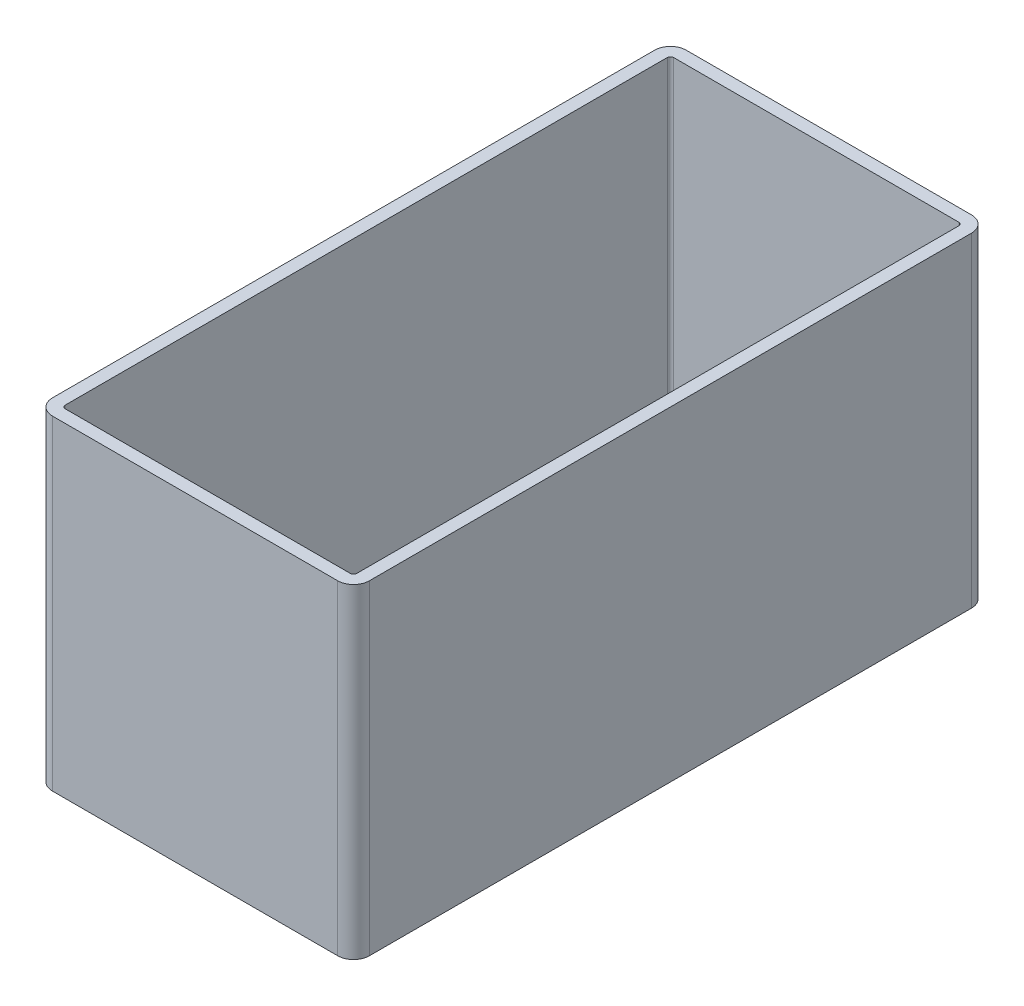
ISO-10303-21;
HEADER;
FILE_DESCRIPTION(('STEP AP214'),'2;1');
FILE_NAME('part.step','',(''),(''),'','','');
FILE_SCHEMA(('AUTOMOTIVE_DESIGN { 1 0 10303 214 1 1 1 1 }'));
ENDSEC;
DATA;
#1=APPLICATION_CONTEXT('core data for automotive mechanical design processes');
#2=APPLICATION_PROTOCOL_DEFINITION('international standard','automotive_design',2000,#1);
#3=PRODUCT_CONTEXT('',#1,'mechanical');
#4=PRODUCT('Part','Part','',(#3));
#5=PRODUCT_RELATED_PRODUCT_CATEGORY('part','',(#4));
#6=PRODUCT_DEFINITION_FORMATION('','',#4);
#7=PRODUCT_DEFINITION_CONTEXT('part definition',#1,'design');
#8=PRODUCT_DEFINITION('design','',#6,#7);
#9=PRODUCT_DEFINITION_SHAPE('','',#8);
#10=(LENGTH_UNIT() NAMED_UNIT(*) SI_UNIT(.MILLI.,.METRE.));
#11=(NAMED_UNIT(*) PLANE_ANGLE_UNIT() SI_UNIT($,.RADIAN.));
#12=(NAMED_UNIT(*) SI_UNIT($,.STERADIAN.) SOLID_ANGLE_UNIT());
#13=UNCERTAINTY_MEASURE_WITH_UNIT(LENGTH_MEASURE(1.E-05),#10,'distance_accuracy_value','');
#14=(GEOMETRIC_REPRESENTATION_CONTEXT(3) GLOBAL_UNCERTAINTY_ASSIGNED_CONTEXT((#13)) GLOBAL_UNIT_ASSIGNED_CONTEXT((#10,
#11,#12)) REPRESENTATION_CONTEXT('',''));
#15=CARTESIAN_POINT('',(0.,0.,0.));
#16=DIRECTION('',(0.,0.,1.));
#17=DIRECTION('',(1.,0.,0.));
#18=AXIS2_PLACEMENT_3D('',#15,#16,#17);
#19=CARTESIAN_POINT('',(10.,10.25,-20.));
#20=DIRECTION('',(-1.,0.,0.));
#21=DIRECTION('',(0.,0.,1.));
#22=AXIS2_PLACEMENT_3D('',#19,#20,#21);
#23=PLANE('',#22);
#24=DIRECTION('',(0.,0.,-1.));
#25=VECTOR('',#24,1.);
#26=CARTESIAN_POINT('',(10.,-10.25,-20.));
#27=LINE('',#26,#25);
#28=CARTESIAN_POINT('',(10.,-10.25,19.));
#29=VERTEX_POINT('',#28);
#30=CARTESIAN_POINT('',(10.,-10.25,-19.));
#31=VERTEX_POINT('',#30);
#32=EDGE_CURVE('E215',#29,#31,#27,.T.);
#33=ORIENTED_EDGE('',*,*,#32,.T.);
#34=DIRECTION('',(0.,-1.,0.));
#35=VECTOR('',#34,1.);
#36=CARTESIAN_POINT('',(10.,10.25,-19.));
#37=LINE('',#36,#35);
#38=CARTESIAN_POINT('',(10.,10.25,-19.));
#39=VERTEX_POINT('',#38);
#40=EDGE_CURVE('E279',#31,#39,#37,.F.);
#41=ORIENTED_EDGE('',*,*,#40,.T.);
#42=DIRECTION('',(0.,0.,-1.));
#43=VECTOR('',#42,1.);
#44=CARTESIAN_POINT('',(10.,10.25,-20.));
#45=LINE('',#44,#43);
#46=CARTESIAN_POINT('',(10.,10.25,19.));
#47=VERTEX_POINT('',#46);
#48=EDGE_CURVE('E227',#47,#39,#45,.T.);
#49=ORIENTED_EDGE('',*,*,#48,.F.);
#50=DIRECTION('',(0.,-1.,0.));
#51=VECTOR('',#50,1.);
#52=CARTESIAN_POINT('',(10.,10.25,19.));
#53=LINE('',#52,#51);
#54=EDGE_CURVE('E276',#47,#29,#53,.T.);
#55=ORIENTED_EDGE('',*,*,#54,.T.);
#56=EDGE_LOOP('',(#33,#41,#49,#55));
#57=FACE_BOUND('',#56,.T.);
#58=ADVANCED_FACE('F46',(#57),#23,.F.);
#59=CARTESIAN_POINT('',(-10.,10.25,-20.));
#60=DIRECTION('',(0.,0.,1.));
#61=DIRECTION('',(1.,0.,0.));
#62=AXIS2_PLACEMENT_3D('',#59,#60,#61);
#63=PLANE('',#62);
#64=DIRECTION('',(-1.,0.,0.));
#65=VECTOR('',#64,1.);
#66=CARTESIAN_POINT('',(-10.,-10.25,-20.));
#67=LINE('',#66,#65);
#68=CARTESIAN_POINT('',(9.,-10.25,-20.));
#69=VERTEX_POINT('',#68);
#70=CARTESIAN_POINT('',(-9.,-10.25,-20.));
#71=VERTEX_POINT('',#70);
#72=EDGE_CURVE('E243',#69,#71,#67,.T.);
#73=ORIENTED_EDGE('',*,*,#72,.T.);
#74=DIRECTION('',(0.,-1.,0.));
#75=VECTOR('',#74,1.);
#76=CARTESIAN_POINT('',(-9.,10.25,-20.));
#77=LINE('',#76,#75);
#78=CARTESIAN_POINT('',(-9.,10.25,-20.));
#79=VERTEX_POINT('',#78);
#80=EDGE_CURVE('E266',#71,#79,#77,.F.);
#81=ORIENTED_EDGE('',*,*,#80,.T.);
#82=DIRECTION('',(-1.,0.,0.));
#83=VECTOR('',#82,1.);
#84=CARTESIAN_POINT('',(-10.,10.25,-20.));
#85=LINE('',#84,#83);
#86=CARTESIAN_POINT('',(9.,10.25,-20.));
#87=VERTEX_POINT('',#86);
#88=EDGE_CURVE('E230',#87,#79,#85,.T.);
#89=ORIENTED_EDGE('',*,*,#88,.F.);
#90=DIRECTION('',(0.,-1.,0.));
#91=VECTOR('',#90,1.);
#92=CARTESIAN_POINT('',(9.,10.25,-20.));
#93=LINE('',#92,#91);
#94=EDGE_CURVE('E263',#87,#69,#93,.T.);
#95=ORIENTED_EDGE('',*,*,#94,.T.);
#96=EDGE_LOOP('',(#73,#81,#89,#95));
#97=FACE_BOUND('',#96,.T.);
#98=ADVANCED_FACE('F307',(#97),#63,.F.);
#99=CARTESIAN_POINT('',(-10.,10.25,-20.));
#100=DIRECTION('',(1.,0.,0.));
#101=DIRECTION('',(0.,0.,-1.));
#102=AXIS2_PLACEMENT_3D('',#99,#100,#101);
#103=PLANE('',#102);
#104=DIRECTION('',(0.,0.,1.));
#105=VECTOR('',#104,1.);
#106=CARTESIAN_POINT('',(-10.,10.25,-20.));
#107=LINE('',#106,#105);
#108=CARTESIAN_POINT('',(-10.,10.25,-19.));
#109=VERTEX_POINT('',#108);
#110=CARTESIAN_POINT('',(-9.99999999999999,10.25,19.));
#111=VERTEX_POINT('',#110);
#112=EDGE_CURVE('E234',#109,#111,#107,.T.);
#113=ORIENTED_EDGE('',*,*,#112,.F.);
#114=DIRECTION('',(0.,-1.,0.));
#115=VECTOR('',#114,1.);
#116=CARTESIAN_POINT('',(-10.,10.25,-19.));
#117=LINE('',#116,#115);
#118=CARTESIAN_POINT('',(-10.,-10.25,-19.));
#119=VERTEX_POINT('',#118);
#120=EDGE_CURVE('E252',#109,#119,#117,.T.);
#121=ORIENTED_EDGE('',*,*,#120,.T.);
#122=DIRECTION('',(0.,0.,1.));
#123=VECTOR('',#122,1.);
#124=CARTESIAN_POINT('',(-10.,-10.25,-20.));
#125=LINE('',#124,#123);
#126=CARTESIAN_POINT('',(-9.99999999999999,-10.25,19.));
#127=VERTEX_POINT('',#126);
#128=EDGE_CURVE('E246',#119,#127,#125,.T.);
#129=ORIENTED_EDGE('',*,*,#128,.T.);
#130=DIRECTION('',(0.,-1.,0.));
#131=VECTOR('',#130,1.);
#132=CARTESIAN_POINT('',(-9.99999999999999,10.25,19.));
#133=LINE('',#132,#131);
#134=EDGE_CURVE('E240',#127,#111,#133,.F.);
#135=ORIENTED_EDGE('',*,*,#134,.T.);
#136=EDGE_LOOP('',(#113,#121,#129,#135));
#137=FACE_BOUND('',#136,.T.);
#138=ADVANCED_FACE('F315',(#137),#103,.F.);
#139=CARTESIAN_POINT('',(-9.99999999999999,10.25,20.));
#140=DIRECTION('',(0.,0.,-1.));
#141=DIRECTION('',(-1.,0.,0.));
#142=AXIS2_PLACEMENT_3D('',#139,#140,#141);
#143=PLANE('',#142);
#144=DIRECTION('',(1.,0.,0.));
#145=VECTOR('',#144,1.);
#146=CARTESIAN_POINT('',(-9.99999999999999,-10.25,20.));
#147=LINE('',#146,#145);
#148=CARTESIAN_POINT('',(-9.,-10.25,20.));
#149=VERTEX_POINT('',#148);
#150=CARTESIAN_POINT('',(9.00000000000001,-10.25,20.));
#151=VERTEX_POINT('',#150);
#152=EDGE_CURVE('E231',#149,#151,#147,.T.);
#153=ORIENTED_EDGE('',*,*,#152,.T.);
#154=DIRECTION('',(0.,-1.,0.));
#155=VECTOR('',#154,1.);
#156=CARTESIAN_POINT('',(9.00000000000001,10.25,20.));
#157=LINE('',#156,#155);
#158=CARTESIAN_POINT('',(9.00000000000001,10.25,20.));
#159=VERTEX_POINT('',#158);
#160=EDGE_CURVE('E13',#151,#159,#157,.F.);
#161=ORIENTED_EDGE('',*,*,#160,.T.);
#162=DIRECTION('',(1.,0.,0.));
#163=VECTOR('',#162,1.);
#164=CARTESIAN_POINT('',(-9.99999999999999,10.25,20.));
#165=LINE('',#164,#163);
#166=CARTESIAN_POINT('',(-9.,10.25,20.));
#167=VERTEX_POINT('',#166);
#168=EDGE_CURVE('E237',#167,#159,#165,.T.);
#169=ORIENTED_EDGE('',*,*,#168,.F.);
#170=DIRECTION('',(0.,-1.,0.));
#171=VECTOR('',#170,1.);
#172=CARTESIAN_POINT('',(-9.,10.25,20.));
#173=LINE('',#172,#171);
#174=EDGE_CURVE('E54',#167,#149,#173,.T.);
#175=ORIENTED_EDGE('',*,*,#174,.T.);
#176=EDGE_LOOP('',(#153,#161,#169,#175));
#177=FACE_BOUND('',#176,.T.);
#178=ADVANCED_FACE('F285',(#177),#143,.F.);
#179=CARTESIAN_POINT('',(0.,10.25,0.));
#180=DIRECTION('',(0.,1.,0.));
#181=DIRECTION('',(0.,0.,1.));
#182=AXIS2_PLACEMENT_3D('',#179,#180,#181);
#183=PLANE('',#182);
#184=CARTESIAN_POINT('',(9.,10.25,-19.));
#185=DIRECTION('',(0.,1.,0.));
#186=DIRECTION('',(0.,0.,1.));
#187=AXIS2_PLACEMENT_3D('',#184,#185,#186);
#188=CIRCLE('',#187,0.200000000000002);
#189=CARTESIAN_POINT('',(9.2,10.25,-19.));
#190=VERTEX_POINT('',#189);
#191=CARTESIAN_POINT('',(9.,10.25,-19.2));
#192=VERTEX_POINT('',#191);
#193=EDGE_CURVE('E61',#190,#192,#188,.T.);
#194=ORIENTED_EDGE('',*,*,#193,.F.);
#195=DIRECTION('',(0.,0.,-1.));
#196=VECTOR('',#195,1.);
#197=CARTESIAN_POINT('',(9.2,10.25,19.));
#198=LINE('',#197,#196);
#199=CARTESIAN_POINT('',(9.20000000000001,10.25,19.));
#200=VERTEX_POINT('',#199);
#201=EDGE_CURVE('E177',#200,#190,#198,.T.);
#202=ORIENTED_EDGE('',*,*,#201,.F.);
#203=CARTESIAN_POINT('',(9.00000000000001,10.25,19.));
#204=DIRECTION('',(0.,1.,0.));
#205=DIRECTION('',(0.,0.,1.));
#206=AXIS2_PLACEMENT_3D('',#203,#204,#205);
#207=CIRCLE('',#206,0.200000000000001);
#208=CARTESIAN_POINT('',(9.00000000000001,10.25,19.2));
#209=VERTEX_POINT('',#208);
#210=EDGE_CURVE('E180',#209,#200,#207,.T.);
#211=ORIENTED_EDGE('',*,*,#210,.F.);
#212=DIRECTION('',(1.,0.,0.));
#213=VECTOR('',#212,1.);
#214=CARTESIAN_POINT('',(-9.,10.25,19.2));
#215=LINE('',#214,#213);
#216=CARTESIAN_POINT('',(-9.,10.25,19.2));
#217=VERTEX_POINT('',#216);
#218=EDGE_CURVE('E208',#217,#209,#215,.T.);
#219=ORIENTED_EDGE('',*,*,#218,.F.);
#220=CARTESIAN_POINT('',(-9.,10.25,19.));
#221=DIRECTION('',(0.,1.,0.));
#222=DIRECTION('',(0.,0.,1.));
#223=AXIS2_PLACEMENT_3D('',#220,#221,#222);
#224=CIRCLE('',#223,0.2);
#225=CARTESIAN_POINT('',(-9.2,10.25,19.));
#226=VERTEX_POINT('',#225);
#227=EDGE_CURVE('E205',#226,#217,#224,.T.);
#228=ORIENTED_EDGE('',*,*,#227,.F.);
#229=DIRECTION('',(0.,0.,1.));
#230=VECTOR('',#229,1.);
#231=CARTESIAN_POINT('',(-9.2,10.25,-19.));
#232=LINE('',#231,#230);
#233=CARTESIAN_POINT('',(-9.2,10.25,-19.));
#234=VERTEX_POINT('',#233);
#235=EDGE_CURVE('E202',#234,#226,#232,.T.);
#236=ORIENTED_EDGE('',*,*,#235,.F.);
#237=CARTESIAN_POINT('',(-9.,10.25,-19.));
#238=DIRECTION('',(0.,1.,0.));
#239=DIRECTION('',(0.,0.,1.));
#240=AXIS2_PLACEMENT_3D('',#237,#238,#239);
#241=CIRCLE('',#240,0.2);
#242=CARTESIAN_POINT('',(-9.,10.25,-19.2));
#243=VERTEX_POINT('',#242);
#244=EDGE_CURVE('E199',#243,#234,#241,.T.);
#245=ORIENTED_EDGE('',*,*,#244,.F.);
#246=DIRECTION('',(-1.,0.,0.));
#247=VECTOR('',#246,1.);
#248=CARTESIAN_POINT('',(9.,10.25,-19.2));
#249=LINE('',#248,#247);
#250=EDGE_CURVE('E197',#192,#243,#249,.T.);
#251=ORIENTED_EDGE('',*,*,#250,.F.);
#252=EDGE_LOOP('',(#194,#202,#211,#219,#228,#236,#245,#251));
#253=FACE_BOUND('',#252,.T.);
#254=ORIENTED_EDGE('',*,*,#88,.T.);
#255=CARTESIAN_POINT('',(-9.,10.25,-19.));
#256=DIRECTION('',(0.,1.,0.));
#257=DIRECTION('',(0.,0.,1.));
#258=AXIS2_PLACEMENT_3D('',#255,#256,#257);
#259=CIRCLE('',#258,1.);
#260=EDGE_CURVE('E274',#79,#109,#259,.T.);
#261=ORIENTED_EDGE('',*,*,#260,.T.);
#262=ORIENTED_EDGE('',*,*,#112,.T.);
#263=CARTESIAN_POINT('',(-9.,10.25,19.));
#264=DIRECTION('',(0.,1.,0.));
#265=DIRECTION('',(0.,0.,1.));
#266=AXIS2_PLACEMENT_3D('',#263,#264,#265);
#267=CIRCLE('',#266,1.);
#268=EDGE_CURVE('E268',#111,#167,#267,.T.);
#269=ORIENTED_EDGE('',*,*,#268,.T.);
#270=ORIENTED_EDGE('',*,*,#168,.T.);
#271=CARTESIAN_POINT('',(9.00000000000001,10.25,19.));
#272=DIRECTION('',(0.,1.,0.));
#273=DIRECTION('',(0.,0.,1.));
#274=AXIS2_PLACEMENT_3D('',#271,#272,#273);
#275=CIRCLE('',#274,1.);
#276=EDGE_CURVE('E270',#159,#47,#275,.T.);
#277=ORIENTED_EDGE('',*,*,#276,.T.);
#278=ORIENTED_EDGE('',*,*,#48,.T.);
#279=CARTESIAN_POINT('',(9.,10.25,-19.));
#280=DIRECTION('',(0.,1.,0.));
#281=DIRECTION('',(0.,0.,1.));
#282=AXIS2_PLACEMENT_3D('',#279,#280,#281);
#283=CIRCLE('',#282,1.);
#284=EDGE_CURVE('E272',#39,#87,#283,.T.);
#285=ORIENTED_EDGE('',*,*,#284,.T.);
#286=EDGE_LOOP('',(#254,#261,#262,#269,#270,#277,#278,#285));
#287=FACE_BOUND('',#286,.T.);
#288=ADVANCED_FACE('F300',(#253,#287),#183,.T.);
#289=CARTESIAN_POINT('',(0.,-10.25,0.));
#290=DIRECTION('',(0.,1.,0.));
#291=DIRECTION('',(0.,0.,1.));
#292=AXIS2_PLACEMENT_3D('',#289,#290,#291);
#293=PLANE('',#292);
#294=DIRECTION('',(0.,0.,-1.));
#295=VECTOR('',#294,1.);
#296=CARTESIAN_POINT('',(9.2,-10.25,19.));
#297=LINE('',#296,#295);
#298=CARTESIAN_POINT('',(9.20000000000001,-10.25,19.));
#299=VERTEX_POINT('',#298);
#300=CARTESIAN_POINT('',(9.2,-10.25,-19.));
#301=VERTEX_POINT('',#300);
#302=EDGE_CURVE('E166',#299,#301,#297,.T.);
#303=ORIENTED_EDGE('',*,*,#302,.T.);
#304=CARTESIAN_POINT('',(9.,-10.25,-19.));
#305=DIRECTION('',(0.,1.,0.));
#306=DIRECTION('',(0.,0.,1.));
#307=AXIS2_PLACEMENT_3D('',#304,#305,#306);
#308=CIRCLE('',#307,0.200000000000002);
#309=CARTESIAN_POINT('',(9.,-10.25,-19.2));
#310=VERTEX_POINT('',#309);
#311=EDGE_CURVE('E160',#301,#310,#308,.T.);
#312=ORIENTED_EDGE('',*,*,#311,.T.);
#313=DIRECTION('',(-1.,0.,0.));
#314=VECTOR('',#313,1.);
#315=CARTESIAN_POINT('',(9.,-10.25,-19.2));
#316=LINE('',#315,#314);
#317=CARTESIAN_POINT('',(-9.,-10.25,-19.2));
#318=VERTEX_POINT('',#317);
#319=EDGE_CURVE('E169',#310,#318,#316,.T.);
#320=ORIENTED_EDGE('',*,*,#319,.T.);
#321=CARTESIAN_POINT('',(-9.,-10.25,-19.));
#322=DIRECTION('',(0.,1.,0.));
#323=DIRECTION('',(0.,0.,1.));
#324=AXIS2_PLACEMENT_3D('',#321,#322,#323);
#325=CIRCLE('',#324,0.2);
#326=CARTESIAN_POINT('',(-9.2,-10.25,-19.));
#327=VERTEX_POINT('',#326);
#328=EDGE_CURVE('E69',#318,#327,#325,.T.);
#329=ORIENTED_EDGE('',*,*,#328,.T.);
#330=DIRECTION('',(0.,0.,1.));
#331=VECTOR('',#330,1.);
#332=CARTESIAN_POINT('',(-9.2,-10.25,-19.));
#333=LINE('',#332,#331);
#334=CARTESIAN_POINT('',(-9.2,-10.25,19.));
#335=VERTEX_POINT('',#334);
#336=EDGE_CURVE('E184',#327,#335,#333,.T.);
#337=ORIENTED_EDGE('',*,*,#336,.T.);
#338=CARTESIAN_POINT('',(-9.,-10.25,19.));
#339=DIRECTION('',(0.,1.,0.));
#340=DIRECTION('',(0.,0.,1.));
#341=AXIS2_PLACEMENT_3D('',#338,#339,#340);
#342=CIRCLE('',#341,0.2);
#343=CARTESIAN_POINT('',(-9.,-10.25,19.2));
#344=VERTEX_POINT('',#343);
#345=EDGE_CURVE('E187',#335,#344,#342,.T.);
#346=ORIENTED_EDGE('',*,*,#345,.T.);
#347=DIRECTION('',(1.,0.,0.));
#348=VECTOR('',#347,1.);
#349=CARTESIAN_POINT('',(-9.,-10.25,19.2));
#350=LINE('',#349,#348);
#351=CARTESIAN_POINT('',(9.00000000000001,-10.25,19.2));
#352=VERTEX_POINT('',#351);
#353=EDGE_CURVE('E190',#344,#352,#350,.T.);
#354=ORIENTED_EDGE('',*,*,#353,.T.);
#355=CARTESIAN_POINT('',(9.00000000000001,-10.25,19.));
#356=DIRECTION('',(0.,1.,0.));
#357=DIRECTION('',(0.,0.,1.));
#358=AXIS2_PLACEMENT_3D('',#355,#356,#357);
#359=CIRCLE('',#358,0.200000000000001);
#360=EDGE_CURVE('E193',#352,#299,#359,.T.);
#361=ORIENTED_EDGE('',*,*,#360,.T.);
#362=EDGE_LOOP('',(#303,#312,#320,#329,#337,#346,#354,#361));
#363=FACE_BOUND('',#362,.T.);
#364=ORIENTED_EDGE('',*,*,#128,.F.);
#365=CARTESIAN_POINT('',(-9.,-10.25,-19.));
#366=DIRECTION('',(0.,1.,0.));
#367=DIRECTION('',(0.,0.,1.));
#368=AXIS2_PLACEMENT_3D('',#365,#366,#367);
#369=CIRCLE('',#368,1.);
#370=EDGE_CURVE('E261',#119,#71,#369,.F.);
#371=ORIENTED_EDGE('',*,*,#370,.T.);
#372=ORIENTED_EDGE('',*,*,#72,.F.);
#373=CARTESIAN_POINT('',(9.,-10.25,-19.));
#374=DIRECTION('',(0.,1.,0.));
#375=DIRECTION('',(0.,0.,1.));
#376=AXIS2_PLACEMENT_3D('',#373,#374,#375);
#377=CIRCLE('',#376,1.);
#378=EDGE_CURVE('E259',#69,#31,#377,.F.);
#379=ORIENTED_EDGE('',*,*,#378,.T.);
#380=ORIENTED_EDGE('',*,*,#32,.F.);
#381=CARTESIAN_POINT('',(9.00000000000001,-10.25,19.));
#382=DIRECTION('',(0.,1.,0.));
#383=DIRECTION('',(0.,0.,1.));
#384=AXIS2_PLACEMENT_3D('',#381,#382,#383);
#385=CIRCLE('',#384,1.);
#386=EDGE_CURVE('E257',#29,#151,#385,.F.);
#387=ORIENTED_EDGE('',*,*,#386,.T.);
#388=ORIENTED_EDGE('',*,*,#152,.F.);
#389=CARTESIAN_POINT('',(-9.,-10.25,19.));
#390=DIRECTION('',(0.,1.,0.));
#391=DIRECTION('',(0.,0.,1.));
#392=AXIS2_PLACEMENT_3D('',#389,#390,#391);
#393=CIRCLE('',#392,1.);
#394=EDGE_CURVE('E255',#149,#127,#393,.F.);
#395=ORIENTED_EDGE('',*,*,#394,.T.);
#396=EDGE_LOOP('',(#364,#371,#372,#379,#380,#387,#388,#395));
#397=FACE_BOUND('',#396,.T.);
#398=ADVANCED_FACE('F173',(#363,#397),#293,.F.);
#399=CARTESIAN_POINT('',(-9.,10.25,-19.));
#400=DIRECTION('',(0.,-1.,0.));
#401=DIRECTION('',(0.,0.,-1.));
#402=AXIS2_PLACEMENT_3D('',#399,#400,#401);
#403=CYLINDRICAL_SURFACE('',#402,1.);
#404=ORIENTED_EDGE('',*,*,#260,.F.);
#405=ORIENTED_EDGE('',*,*,#80,.F.);
#406=ORIENTED_EDGE('',*,*,#370,.F.);
#407=ORIENTED_EDGE('',*,*,#120,.F.);
#408=EDGE_LOOP('',(#404,#405,#406,#407));
#409=FACE_BOUND('',#408,.T.);
#410=ADVANCED_FACE('F312',(#409),#403,.T.);
#411=CARTESIAN_POINT('',(9.,10.25,-19.));
#412=DIRECTION('',(0.,-1.,0.));
#413=DIRECTION('',(0.,0.,-1.));
#414=AXIS2_PLACEMENT_3D('',#411,#412,#413);
#415=CYLINDRICAL_SURFACE('',#414,1.);
#416=ORIENTED_EDGE('',*,*,#284,.F.);
#417=ORIENTED_EDGE('',*,*,#40,.F.);
#418=ORIENTED_EDGE('',*,*,#378,.F.);
#419=ORIENTED_EDGE('',*,*,#94,.F.);
#420=EDGE_LOOP('',(#416,#417,#418,#419));
#421=FACE_BOUND('',#420,.T.);
#422=ADVANCED_FACE('F304',(#421),#415,.T.);
#423=CARTESIAN_POINT('',(9.00000000000001,10.25,19.));
#424=DIRECTION('',(0.,-1.,0.));
#425=DIRECTION('',(0.,0.,-1.));
#426=AXIS2_PLACEMENT_3D('',#423,#424,#425);
#427=CYLINDRICAL_SURFACE('',#426,1.);
#428=ORIENTED_EDGE('',*,*,#276,.F.);
#429=ORIENTED_EDGE('',*,*,#160,.F.);
#430=ORIENTED_EDGE('',*,*,#386,.F.);
#431=ORIENTED_EDGE('',*,*,#54,.F.);
#432=EDGE_LOOP('',(#428,#429,#430,#431));
#433=FACE_BOUND('',#432,.T.);
#434=ADVANCED_FACE('F294',(#433),#427,.T.);
#435=CARTESIAN_POINT('',(-9.,10.25,19.));
#436=DIRECTION('',(0.,-1.,0.));
#437=DIRECTION('',(0.,0.,-1.));
#438=AXIS2_PLACEMENT_3D('',#435,#436,#437);
#439=CYLINDRICAL_SURFACE('',#438,1.);
#440=ORIENTED_EDGE('',*,*,#268,.F.);
#441=ORIENTED_EDGE('',*,*,#134,.F.);
#442=ORIENTED_EDGE('',*,*,#394,.F.);
#443=ORIENTED_EDGE('',*,*,#174,.F.);
#444=EDGE_LOOP('',(#440,#441,#442,#443));
#445=FACE_BOUND('',#444,.T.);
#446=ADVANCED_FACE('F48',(#445),#439,.T.);
#447=CARTESIAN_POINT('',(9.,-10.25,-19.));
#448=DIRECTION('',(0.,1.,0.));
#449=DIRECTION('',(0.,0.,1.));
#450=AXIS2_PLACEMENT_3D('',#447,#448,#449);
#451=CYLINDRICAL_SURFACE('',#450,0.200000000000002);
#452=ORIENTED_EDGE('',*,*,#193,.T.);
#453=DIRECTION('',(0.,1.,0.));
#454=VECTOR('',#453,1.);
#455=CARTESIAN_POINT('',(9.,-10.25,-19.2));
#456=LINE('',#455,#454);
#457=EDGE_CURVE('E156',#310,#192,#456,.T.);
#458=ORIENTED_EDGE('',*,*,#457,.F.);
#459=ORIENTED_EDGE('',*,*,#311,.F.);
#460=DIRECTION('',(0.,1.,0.));
#461=VECTOR('',#460,1.);
#462=CARTESIAN_POINT('',(9.2,-10.25,-19.));
#463=LINE('',#462,#461);
#464=EDGE_CURVE('E213',#301,#190,#463,.T.);
#465=ORIENTED_EDGE('',*,*,#464,.T.);
#466=EDGE_LOOP('',(#452,#458,#459,#465));
#467=FACE_BOUND('',#466,.T.);
#468=ADVANCED_FACE('F158',(#467),#451,.F.);
#469=CARTESIAN_POINT('',(9.2,-10.25,19.));
#470=DIRECTION('',(1.,0.,0.));
#471=DIRECTION('',(0.,0.,-1.));
#472=AXIS2_PLACEMENT_3D('',#469,#470,#471);
#473=PLANE('',#472);
#474=ORIENTED_EDGE('',*,*,#201,.T.);
#475=ORIENTED_EDGE('',*,*,#464,.F.);
#476=ORIENTED_EDGE('',*,*,#302,.F.);
#477=DIRECTION('',(0.,1.,0.));
#478=VECTOR('',#477,1.);
#479=CARTESIAN_POINT('',(9.20000000000001,-10.25,19.));
#480=LINE('',#479,#478);
#481=EDGE_CURVE('E216',#299,#200,#480,.T.);
#482=ORIENTED_EDGE('',*,*,#481,.T.);
#483=EDGE_LOOP('',(#474,#475,#476,#482));
#484=FACE_BOUND('',#483,.T.);
#485=ADVANCED_FACE('F322',(#484),#473,.F.);
#486=CARTESIAN_POINT('',(9.00000000000001,-10.25,19.));
#487=DIRECTION('',(0.,1.,0.));
#488=DIRECTION('',(0.,0.,1.));
#489=AXIS2_PLACEMENT_3D('',#486,#487,#488);
#490=CYLINDRICAL_SURFACE('',#489,0.200000000000001);
#491=ORIENTED_EDGE('',*,*,#210,.T.);
#492=ORIENTED_EDGE('',*,*,#481,.F.);
#493=ORIENTED_EDGE('',*,*,#360,.F.);
#494=DIRECTION('',(0.,1.,0.));
#495=VECTOR('',#494,1.);
#496=CARTESIAN_POINT('',(9.00000000000001,-10.25,19.2));
#497=LINE('',#496,#495);
#498=EDGE_CURVE('E218',#352,#209,#497,.T.);
#499=ORIENTED_EDGE('',*,*,#498,.T.);
#500=EDGE_LOOP('',(#491,#492,#493,#499));
#501=FACE_BOUND('',#500,.T.);
#502=ADVANCED_FACE('F382',(#501),#490,.F.);
#503=CARTESIAN_POINT('',(-9.,-10.25,19.2));
#504=DIRECTION('',(0.,0.,1.));
#505=DIRECTION('',(1.,0.,0.));
#506=AXIS2_PLACEMENT_3D('',#503,#504,#505);
#507=PLANE('',#506);
#508=ORIENTED_EDGE('',*,*,#218,.T.);
#509=ORIENTED_EDGE('',*,*,#498,.F.);
#510=ORIENTED_EDGE('',*,*,#353,.F.);
#511=DIRECTION('',(0.,1.,0.));
#512=VECTOR('',#511,1.);
#513=CARTESIAN_POINT('',(-9.,-10.25,19.2));
#514=LINE('',#513,#512);
#515=EDGE_CURVE('E220',#344,#217,#514,.T.);
#516=ORIENTED_EDGE('',*,*,#515,.T.);
#517=EDGE_LOOP('',(#508,#509,#510,#516));
#518=FACE_BOUND('',#517,.T.);
#519=ADVANCED_FACE('F392',(#518),#507,.F.);
#520=CARTESIAN_POINT('',(-9.,-10.25,19.));
#521=DIRECTION('',(0.,1.,0.));
#522=DIRECTION('',(0.,0.,1.));
#523=AXIS2_PLACEMENT_3D('',#520,#521,#522);
#524=CYLINDRICAL_SURFACE('',#523,0.2);
#525=ORIENTED_EDGE('',*,*,#227,.T.);
#526=ORIENTED_EDGE('',*,*,#515,.F.);
#527=ORIENTED_EDGE('',*,*,#345,.F.);
#528=DIRECTION('',(0.,1.,0.));
#529=VECTOR('',#528,1.);
#530=CARTESIAN_POINT('',(-9.2,-10.25,19.));
#531=LINE('',#530,#529);
#532=EDGE_CURVE('E222',#335,#226,#531,.T.);
#533=ORIENTED_EDGE('',*,*,#532,.T.);
#534=EDGE_LOOP('',(#525,#526,#527,#533));
#535=FACE_BOUND('',#534,.T.);
#536=ADVANCED_FACE('F402',(#535),#524,.F.);
#537=CARTESIAN_POINT('',(-9.2,-10.25,-19.));
#538=DIRECTION('',(-1.,0.,0.));
#539=DIRECTION('',(0.,0.,1.));
#540=AXIS2_PLACEMENT_3D('',#537,#538,#539);
#541=PLANE('',#540);
#542=ORIENTED_EDGE('',*,*,#235,.T.);
#543=ORIENTED_EDGE('',*,*,#532,.F.);
#544=ORIENTED_EDGE('',*,*,#336,.F.);
#545=DIRECTION('',(0.,1.,0.));
#546=VECTOR('',#545,1.);
#547=CARTESIAN_POINT('',(-9.2,-10.25,-19.));
#548=LINE('',#547,#546);
#549=EDGE_CURVE('E224',#327,#234,#548,.T.);
#550=ORIENTED_EDGE('',*,*,#549,.T.);
#551=EDGE_LOOP('',(#542,#543,#544,#550));
#552=FACE_BOUND('',#551,.T.);
#553=ADVANCED_FACE('F412',(#552),#541,.F.);
#554=CARTESIAN_POINT('',(-9.,-10.25,-19.));
#555=DIRECTION('',(0.,1.,0.));
#556=DIRECTION('',(0.,0.,1.));
#557=AXIS2_PLACEMENT_3D('',#554,#555,#556);
#558=CYLINDRICAL_SURFACE('',#557,0.2);
#559=ORIENTED_EDGE('',*,*,#244,.T.);
#560=ORIENTED_EDGE('',*,*,#549,.F.);
#561=ORIENTED_EDGE('',*,*,#328,.F.);
#562=DIRECTION('',(0.,1.,0.));
#563=VECTOR('',#562,1.);
#564=CARTESIAN_POINT('',(-9.,-10.25,-19.2));
#565=LINE('',#564,#563);
#566=EDGE_CURVE('E165',#318,#243,#565,.T.);
#567=ORIENTED_EDGE('',*,*,#566,.T.);
#568=EDGE_LOOP('',(#559,#560,#561,#567));
#569=FACE_BOUND('',#568,.T.);
#570=ADVANCED_FACE('F422',(#569),#558,.F.);
#571=CARTESIAN_POINT('',(9.,-10.25,-19.2));
#572=DIRECTION('',(0.,0.,-1.));
#573=DIRECTION('',(-1.,0.,0.));
#574=AXIS2_PLACEMENT_3D('',#571,#572,#573);
#575=PLANE('',#574);
#576=ORIENTED_EDGE('',*,*,#250,.T.);
#577=ORIENTED_EDGE('',*,*,#566,.F.);
#578=ORIENTED_EDGE('',*,*,#319,.F.);
#579=ORIENTED_EDGE('',*,*,#457,.T.);
#580=EDGE_LOOP('',(#576,#577,#578,#579));
#581=FACE_BOUND('',#580,.T.);
#582=ADVANCED_FACE('F170',(#581),#575,.F.);
#583=CLOSED_SHELL('',(#58,#98,#138,#178,#288,#398,#410,#422,#434,#446,#468,#485,#502,#519,#536,
#553,#570,#582));
#584=MANIFOLD_SOLID_BREP('B2',#583);
#585=ADVANCED_BREP_SHAPE_REPRESENTATION('',(#18,#584),#14);
#586=SHAPE_DEFINITION_REPRESENTATION(#9,#585);
ENDSEC;
END-ISO-10303-21;
